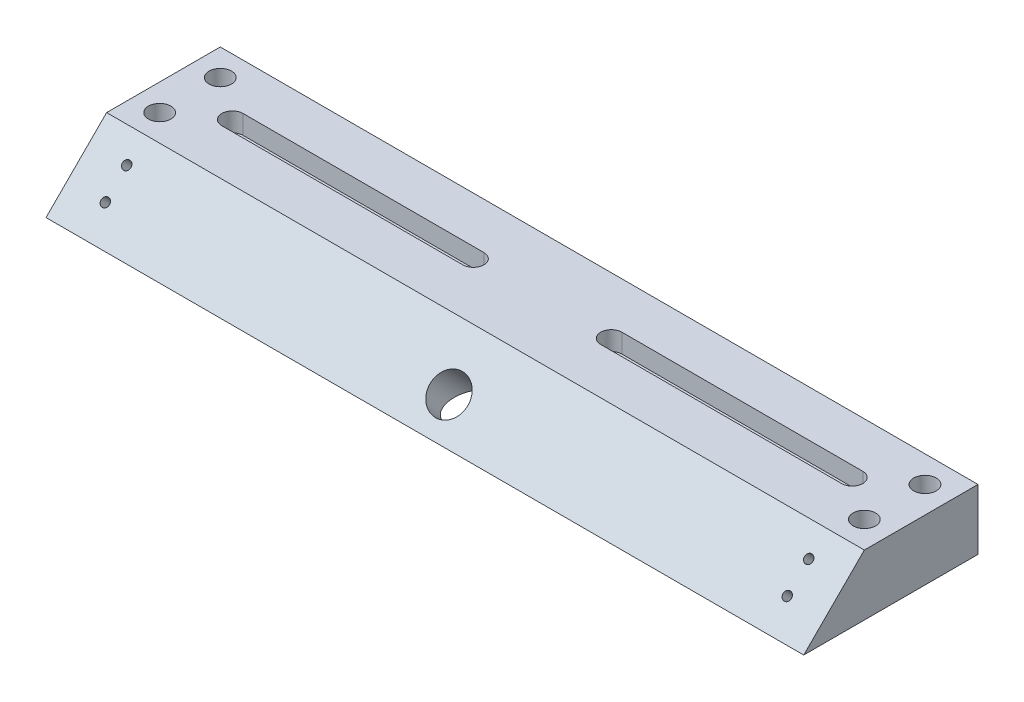
ISO-10303-21;
HEADER;
FILE_DESCRIPTION(('STEP AP214'),'2;1');
FILE_NAME('part.step','',(''),(''),'','','');
FILE_SCHEMA(('AUTOMOTIVE_DESIGN { 1 0 10303 214 1 1 1 1 }'));
ENDSEC;
DATA;
#1=APPLICATION_CONTEXT('core data for automotive mechanical design processes');
#2=APPLICATION_PROTOCOL_DEFINITION('international standard','automotive_design',2000,#1);
#3=PRODUCT_CONTEXT('',#1,'mechanical');
#4=PRODUCT('Part','Part','',(#3));
#5=PRODUCT_RELATED_PRODUCT_CATEGORY('part','',(#4));
#6=PRODUCT_DEFINITION_FORMATION('','',#4);
#7=PRODUCT_DEFINITION_CONTEXT('part definition',#1,'design');
#8=PRODUCT_DEFINITION('design','',#6,#7);
#9=PRODUCT_DEFINITION_SHAPE('','',#8);
#10=(LENGTH_UNIT() NAMED_UNIT(*) SI_UNIT(.MILLI.,.METRE.));
#11=(NAMED_UNIT(*) PLANE_ANGLE_UNIT() SI_UNIT($,.RADIAN.));
#12=(NAMED_UNIT(*) SI_UNIT($,.STERADIAN.) SOLID_ANGLE_UNIT());
#13=UNCERTAINTY_MEASURE_WITH_UNIT(LENGTH_MEASURE(1.E-05),#10,'distance_accuracy_value','');
#14=(GEOMETRIC_REPRESENTATION_CONTEXT(3) GLOBAL_UNCERTAINTY_ASSIGNED_CONTEXT((#13)) GLOBAL_UNIT_ASSIGNED_CONTEXT((#10,
#11,#12)) REPRESENTATION_CONTEXT('',''));
#15=CARTESIAN_POINT('',(0.,0.,0.));
#16=DIRECTION('',(0.,0.,1.));
#17=DIRECTION('',(1.,0.,0.));
#18=AXIS2_PLACEMENT_3D('',#15,#16,#17);
#19=CARTESIAN_POINT('',(0.,20.32,0.));
#20=DIRECTION('',(0.,-1.,0.));
#21=DIRECTION('',(0.,0.,-1.));
#22=AXIS2_PLACEMENT_3D('',#19,#20,#21);
#23=PLANE('',#22);
#24=DIRECTION('',(-1.,0.,0.));
#25=VECTOR('',#24,1.);
#26=CARTESIAN_POINT('',(0.,20.32,-9.1440000000002));
#27=LINE('',#26,#25);
#28=CARTESIAN_POINT('',(103.886,20.32,-9.14400000000019));
#29=VERTEX_POINT('',#28);
#30=CARTESIAN_POINT('',(23.114,20.32,-9.1440000000002));
#31=VERTEX_POINT('',#30);
#32=EDGE_CURVE('E158',#29,#31,#27,.T.);
#33=ORIENTED_EDGE('',*,*,#32,.T.);
#34=CARTESIAN_POINT('',(23.114,20.32,-12.7000000000002));
#35=DIRECTION('',(0.,-1.,0.));
#36=DIRECTION('',(0.,0.,1.));
#37=AXIS2_PLACEMENT_3D('',#34,#35,#36);
#38=CIRCLE('',#37,3.55599999999999);
#39=CARTESIAN_POINT('',(23.114,20.32,-16.2560000000002));
#40=VERTEX_POINT('',#39);
#41=EDGE_CURVE('E52',#40,#31,#38,.F.);
#42=ORIENTED_EDGE('',*,*,#41,.F.);
#43=DIRECTION('',(-1.,0.,0.));
#44=VECTOR('',#43,1.);
#45=CARTESIAN_POINT('',(0.,20.32,-16.2560000000002));
#46=LINE('',#45,#44);
#47=CARTESIAN_POINT('',(103.886,20.32,-16.2560000000002));
#48=VERTEX_POINT('',#47);
#49=EDGE_CURVE('E146',#48,#40,#46,.T.);
#50=ORIENTED_EDGE('',*,*,#49,.F.);
#51=CARTESIAN_POINT('',(103.886,20.32,-12.7000000000002));
#52=DIRECTION('',(0.,-1.,0.));
#53=DIRECTION('',(0.,0.,1.));
#54=AXIS2_PLACEMENT_3D('',#51,#52,#53);
#55=CIRCLE('',#54,3.556);
#56=EDGE_CURVE('E149',#48,#29,#55,.T.);
#57=ORIENTED_EDGE('',*,*,#56,.T.);
#58=EDGE_LOOP('',(#33,#42,#50,#57));
#59=FACE_BOUND('',#58,.T.);
#60=CARTESIAN_POINT('',(-118.11,20.32,-22.86));
#61=DIRECTION('',(0.,1.,0.));
#62=DIRECTION('',(0.,0.,-1.));
#63=AXIS2_PLACEMENT_3D('',#60,#61,#62);
#64=CIRCLE('',#63,3.7719);
#65=CARTESIAN_POINT('',(-118.11,20.32,-26.6319));
#66=VERTEX_POINT('',#65);
#67=EDGE_CURVE('E179',#66,#66,#64,.T.);
#68=ORIENTED_EDGE('',*,*,#67,.F.);
#69=EDGE_LOOP('',(#68));
#70=FACE_BOUND('',#69,.T.);
#71=CARTESIAN_POINT('',(118.11,20.32,-2.54000000000001));
#72=DIRECTION('',(0.,1.,0.));
#73=DIRECTION('',(0.,0.,-1.));
#74=AXIS2_PLACEMENT_3D('',#71,#72,#73);
#75=CIRCLE('',#74,3.7719);
#76=CARTESIAN_POINT('',(118.11,20.32,-6.31190000000001));
#77=VERTEX_POINT('',#76);
#78=EDGE_CURVE('E172',#77,#77,#75,.T.);
#79=ORIENTED_EDGE('',*,*,#78,.F.);
#80=EDGE_LOOP('',(#79));
#81=FACE_BOUND('',#80,.T.);
#82=CARTESIAN_POINT('',(118.11,20.32,-22.86));
#83=DIRECTION('',(0.,1.,0.));
#84=DIRECTION('',(0.,0.,1.));
#85=AXIS2_PLACEMENT_3D('',#82,#83,#84);
#86=CIRCLE('',#85,3.7719);
#87=CARTESIAN_POINT('',(118.11,20.32,-19.0881));
#88=VERTEX_POINT('',#87);
#89=EDGE_CURVE('E165',#88,#88,#86,.T.);
#90=ORIENTED_EDGE('',*,*,#89,.F.);
#91=EDGE_LOOP('',(#90));
#92=FACE_BOUND('',#91,.T.);
#93=CARTESIAN_POINT('',(-118.11,20.32,-2.54000000000001));
#94=DIRECTION('',(0.,1.,0.));
#95=DIRECTION('',(0.,0.,1.));
#96=AXIS2_PLACEMENT_3D('',#93,#94,#95);
#97=CIRCLE('',#96,3.7719);
#98=CARTESIAN_POINT('',(-118.11,20.32,1.23189999999998));
#99=VERTEX_POINT('',#98);
#100=EDGE_CURVE('E178',#99,#99,#97,.T.);
#101=ORIENTED_EDGE('',*,*,#100,.F.);
#102=EDGE_LOOP('',(#101));
#103=FACE_BOUND('',#102,.T.);
#104=DIRECTION('',(0.,0.,1.));
#105=VECTOR('',#104,1.);
#106=CARTESIAN_POINT('',(-127.,20.32,31.75));
#107=LINE('',#106,#105);
#108=CARTESIAN_POINT('',(-127.,20.32,-31.75));
#109=VERTEX_POINT('',#108);
#110=CARTESIAN_POINT('',(-127.,20.32,6.34999999999956));
#111=VERTEX_POINT('',#110);
#112=EDGE_CURVE('E226',#109,#111,#107,.T.);
#113=ORIENTED_EDGE('',*,*,#112,.T.);
#114=DIRECTION('',(1.,0.,0.));
#115=VECTOR('',#114,1.);
#116=CARTESIAN_POINT('',(0.,20.32,6.34999999999956));
#117=LINE('',#116,#115);
#118=CARTESIAN_POINT('',(127.,20.32,6.34999999999956));
#119=VERTEX_POINT('',#118);
#120=EDGE_CURVE('E240',#111,#119,#117,.T.);
#121=ORIENTED_EDGE('',*,*,#120,.T.);
#122=DIRECTION('',(0.,0.,-1.));
#123=VECTOR('',#122,1.);
#124=CARTESIAN_POINT('',(127.,20.32,31.75));
#125=LINE('',#124,#123);
#126=CARTESIAN_POINT('',(127.,20.32,-31.75));
#127=VERTEX_POINT('',#126);
#128=EDGE_CURVE('E221',#119,#127,#125,.T.);
#129=ORIENTED_EDGE('',*,*,#128,.T.);
#130=DIRECTION('',(-1.,0.,0.));
#131=VECTOR('',#130,1.);
#132=CARTESIAN_POINT('',(-127.,20.32,-31.75));
#133=LINE('',#132,#131);
#134=EDGE_CURVE('E223',#127,#109,#133,.T.);
#135=ORIENTED_EDGE('',*,*,#134,.T.);
#136=EDGE_LOOP('',(#113,#121,#129,#135));
#137=FACE_BOUND('',#136,.T.);
#138=CARTESIAN_POINT('',(-23.114,20.32,-12.7000000000002));
#139=DIRECTION('',(0.,1.,0.));
#140=DIRECTION('',(0.,0.,1.));
#141=AXIS2_PLACEMENT_3D('',#138,#139,#140);
#142=CIRCLE('',#141,3.55599999999999);
#143=CARTESIAN_POINT('',(-23.114,20.32,-16.2560000000002));
#144=VERTEX_POINT('',#143);
#145=CARTESIAN_POINT('',(-23.114,20.32,-9.1440000000002));
#146=VERTEX_POINT('',#145);
#147=EDGE_CURVE('E60',#144,#146,#142,.F.);
#148=ORIENTED_EDGE('',*,*,#147,.T.);
#149=DIRECTION('',(1.,0.,0.));
#150=VECTOR('',#149,1.);
#151=CARTESIAN_POINT('',(0.,20.32,-9.1440000000002));
#152=LINE('',#151,#150);
#153=CARTESIAN_POINT('',(-103.886,20.32,-9.14400000000019));
#154=VERTEX_POINT('',#153);
#155=EDGE_CURVE('E195',#154,#146,#152,.T.);
#156=ORIENTED_EDGE('',*,*,#155,.F.);
#157=CARTESIAN_POINT('',(-103.886,20.32,-12.7000000000002));
#158=DIRECTION('',(0.,1.,0.));
#159=DIRECTION('',(0.,0.,1.));
#160=AXIS2_PLACEMENT_3D('',#157,#158,#159);
#161=CIRCLE('',#160,3.556);
#162=CARTESIAN_POINT('',(-103.886,20.32,-16.2560000000002));
#163=VERTEX_POINT('',#162);
#164=EDGE_CURVE('E208',#163,#154,#161,.T.);
#165=ORIENTED_EDGE('',*,*,#164,.F.);
#166=DIRECTION('',(1.,0.,0.));
#167=VECTOR('',#166,1.);
#168=CARTESIAN_POINT('',(0.,20.32,-16.2560000000002));
#169=LINE('',#168,#167);
#170=EDGE_CURVE('E205',#163,#144,#169,.T.);
#171=ORIENTED_EDGE('',*,*,#170,.T.);
#172=EDGE_LOOP('',(#148,#156,#165,#171));
#173=FACE_BOUND('',#172,.T.);
#174=ADVANCED_FACE('F36',(#59,#70,#81,#92,#103,#137,#173),#23,.F.);
#175=CARTESIAN_POINT('',(127.,20.32,31.75));
#176=DIRECTION('',(-1.,0.,0.));
#177=DIRECTION('',(0.,0.,1.));
#178=AXIS2_PLACEMENT_3D('',#175,#176,#177);
#179=PLANE('',#178);
#180=ORIENTED_EDGE('',*,*,#128,.F.);
#181=DIRECTION('',(0.,0.707106781186544,-0.707106781186551));
#182=VECTOR('',#181,1.);
#183=CARTESIAN_POINT('',(127.,20.32,6.34999999999956));
#184=LINE('',#183,#182);
#185=CARTESIAN_POINT('',(127.,0.,26.6699999999998));
#186=VERTEX_POINT('',#185);
#187=EDGE_CURVE('E243',#119,#186,#184,.F.);
#188=ORIENTED_EDGE('',*,*,#187,.T.);
#189=DIRECTION('',(0.,0.,-1.));
#190=VECTOR('',#189,1.);
#191=CARTESIAN_POINT('',(127.,0.,31.75));
#192=LINE('',#191,#190);
#193=CARTESIAN_POINT('',(127.,0.,-31.75));
#194=VERTEX_POINT('',#193);
#195=EDGE_CURVE('E215',#186,#194,#192,.T.);
#196=ORIENTED_EDGE('',*,*,#195,.T.);
#197=DIRECTION('',(0.,-1.,0.));
#198=VECTOR('',#197,1.);
#199=CARTESIAN_POINT('',(127.,20.32,-31.75));
#200=LINE('',#199,#198);
#201=EDGE_CURVE('E237',#127,#194,#200,.T.);
#202=ORIENTED_EDGE('',*,*,#201,.F.);
#203=EDGE_LOOP('',(#180,#188,#196,#202));
#204=FACE_BOUND('',#203,.T.);
#205=ADVANCED_FACE('F263',(#204),#179,.F.);
#206=CARTESIAN_POINT('',(-127.,20.32,-31.75));
#207=DIRECTION('',(0.,0.,1.));
#208=DIRECTION('',(1.,0.,0.));
#209=AXIS2_PLACEMENT_3D('',#206,#207,#208);
#210=PLANE('',#209);
#211=DIRECTION('',(-1.,0.,0.));
#212=VECTOR('',#211,1.);
#213=CARTESIAN_POINT('',(-127.,0.,-31.75));
#214=LINE('',#213,#212);
#215=CARTESIAN_POINT('',(-127.,0.,-31.75));
#216=VERTEX_POINT('',#215);
#217=EDGE_CURVE('E231',#194,#216,#214,.T.);
#218=ORIENTED_EDGE('',*,*,#217,.T.);
#219=DIRECTION('',(0.,-1.,0.));
#220=VECTOR('',#219,1.);
#221=CARTESIAN_POINT('',(-127.,20.32,-31.75));
#222=LINE('',#221,#220);
#223=EDGE_CURVE('E229',#109,#216,#222,.T.);
#224=ORIENTED_EDGE('',*,*,#223,.F.);
#225=ORIENTED_EDGE('',*,*,#134,.F.);
#226=ORIENTED_EDGE('',*,*,#201,.T.);
#227=EDGE_LOOP('',(#218,#224,#225,#226));
#228=FACE_BOUND('',#227,.T.);
#229=ADVANCED_FACE('F265',(#228),#210,.F.);
#230=CARTESIAN_POINT('',(-127.,20.32,31.75));
#231=DIRECTION('',(1.,0.,0.));
#232=DIRECTION('',(0.,0.,-1.));
#233=AXIS2_PLACEMENT_3D('',#230,#231,#232);
#234=PLANE('',#233);
#235=DIRECTION('',(0.,0.,1.));
#236=VECTOR('',#235,1.);
#237=CARTESIAN_POINT('',(-127.,0.,31.75));
#238=LINE('',#237,#236);
#239=CARTESIAN_POINT('',(-127.,0.,26.6699999999998));
#240=VERTEX_POINT('',#239);
#241=EDGE_CURVE('E224',#216,#240,#238,.T.);
#242=ORIENTED_EDGE('',*,*,#241,.T.);
#243=DIRECTION('',(0.,-0.707106781186544,0.707106781186551));
#244=VECTOR('',#243,1.);
#245=CARTESIAN_POINT('',(-127.,20.32,6.34999999999956));
#246=LINE('',#245,#244);
#247=EDGE_CURVE('E11',#240,#111,#246,.F.);
#248=ORIENTED_EDGE('',*,*,#247,.T.);
#249=ORIENTED_EDGE('',*,*,#112,.F.);
#250=ORIENTED_EDGE('',*,*,#223,.T.);
#251=EDGE_LOOP('',(#242,#248,#249,#250));
#252=FACE_BOUND('',#251,.T.);
#253=ADVANCED_FACE('F253',(#252),#234,.F.);
#254=CARTESIAN_POINT('',(0.,0.,0.));
#255=DIRECTION('',(0.,-1.,0.));
#256=DIRECTION('',(0.,0.,-1.));
#257=AXIS2_PLACEMENT_3D('',#254,#255,#256);
#258=PLANE('',#257);
#259=CARTESIAN_POINT('',(0.,0.,10.5055389820753));
#260=DIRECTION('',(0.,-1.,0.));
#261=DIRECTION('',(0.,0.,1.));
#262=AXIS2_PLACEMENT_3D('',#259,#260,#261);
#263=ELLIPSE('',#262,8.98025612106911,6.35);
#264=CARTESIAN_POINT('',(0.,0.,19.4857951031444));
#265=VERTEX_POINT('',#264);
#266=EDGE_CURVE('E292',#265,#265,#263,.T.);
#267=ORIENTED_EDGE('',*,*,#266,.F.);
#268=EDGE_LOOP('',(#267));
#269=FACE_BOUND('',#268,.T.);
#270=CARTESIAN_POINT('',(-118.11,0.,-22.86));
#271=DIRECTION('',(0.,1.,0.));
#272=DIRECTION('',(0.,0.,-1.));
#273=AXIS2_PLACEMENT_3D('',#270,#271,#272);
#274=CIRCLE('',#273,3.7719);
#275=CARTESIAN_POINT('',(-118.11,0.,-26.6319));
#276=VERTEX_POINT('',#275);
#277=EDGE_CURVE('E175',#276,#276,#274,.T.);
#278=ORIENTED_EDGE('',*,*,#277,.T.);
#279=EDGE_LOOP('',(#278));
#280=FACE_BOUND('',#279,.T.);
#281=CARTESIAN_POINT('',(118.11,0.,-2.54000000000001));
#282=DIRECTION('',(0.,1.,0.));
#283=DIRECTION('',(0.,0.,-1.));
#284=AXIS2_PLACEMENT_3D('',#281,#282,#283);
#285=CIRCLE('',#284,3.7719);
#286=CARTESIAN_POINT('',(118.11,0.,-6.31190000000001));
#287=VERTEX_POINT('',#286);
#288=EDGE_CURVE('E182',#287,#287,#285,.T.);
#289=ORIENTED_EDGE('',*,*,#288,.T.);
#290=EDGE_LOOP('',(#289));
#291=FACE_BOUND('',#290,.T.);
#292=CARTESIAN_POINT('',(118.11,0.,-22.86));
#293=DIRECTION('',(0.,1.,0.));
#294=DIRECTION('',(0.,0.,1.));
#295=AXIS2_PLACEMENT_3D('',#292,#293,#294);
#296=CIRCLE('',#295,3.7719);
#297=CARTESIAN_POINT('',(118.11,0.,-19.0881));
#298=VERTEX_POINT('',#297);
#299=EDGE_CURVE('E169',#298,#298,#296,.T.);
#300=ORIENTED_EDGE('',*,*,#299,.T.);
#301=EDGE_LOOP('',(#300));
#302=FACE_BOUND('',#301,.T.);
#303=CARTESIAN_POINT('',(-118.11,0.,-2.54000000000001));
#304=DIRECTION('',(0.,1.,0.));
#305=DIRECTION('',(0.,0.,1.));
#306=AXIS2_PLACEMENT_3D('',#303,#304,#305);
#307=CIRCLE('',#306,3.7719);
#308=CARTESIAN_POINT('',(-118.11,0.,1.23189999999998));
#309=VERTEX_POINT('',#308);
#310=EDGE_CURVE('E187',#309,#309,#307,.T.);
#311=ORIENTED_EDGE('',*,*,#310,.T.);
#312=EDGE_LOOP('',(#311));
#313=FACE_BOUND('',#312,.T.);
#314=ORIENTED_EDGE('',*,*,#195,.F.);
#315=DIRECTION('',(1.,0.,0.));
#316=VECTOR('',#315,1.);
#317=CARTESIAN_POINT('',(0.,0.,26.6699999999998));
#318=LINE('',#317,#316);
#319=EDGE_CURVE('E45',#186,#240,#318,.F.);
#320=ORIENTED_EDGE('',*,*,#319,.T.);
#321=ORIENTED_EDGE('',*,*,#241,.F.);
#322=ORIENTED_EDGE('',*,*,#217,.F.);
#323=EDGE_LOOP('',(#314,#320,#321,#322));
#324=FACE_BOUND('',#323,.T.);
#325=ADVANCED_FACE('F248',(#269,#280,#291,#302,#313,#324),#258,.T.);
#326=CARTESIAN_POINT('',(0.,20.32,6.34999999999956));
#327=DIRECTION('',(0.,-0.707106781186551,-0.707106781186544));
#328=DIRECTION('',(1.,0.,0.));
#329=AXIS2_PLACEMENT_3D('',#326,#327,#328);
#330=PLANE('',#329);
#331=CARTESIAN_POINT('',(0.,8.08223050896222,18.5877694910375));
#332=DIRECTION('',(0.,0.707106781186551,0.707106781186544));
#333=DIRECTION('',(0.,-0.707106781186544,0.707106781186551));
#334=AXIS2_PLACEMENT_3D('',#331,#332,#333);
#335=CIRCLE('',#334,6.35);
#336=CARTESIAN_POINT('',(0.,3.59210244842766,23.0778975515721));
#337=VERTEX_POINT('',#336);
#338=EDGE_CURVE('E546',#337,#337,#335,.T.);
#339=ORIENTED_EDGE('',*,*,#338,.F.);
#340=EDGE_LOOP('',(#339));
#341=FACE_BOUND('',#340,.T.);
#342=CARTESIAN_POINT('',(114.3,14.3684097937106,12.3015902062891));
#343=DIRECTION('',(0.,0.707106781186546,0.707106781186549));
#344=DIRECTION('',(0.,0.707106781186549,-0.707106781186546));
#345=AXIS2_PLACEMENT_3D('',#342,#343,#344);
#346=CIRCLE('',#345,1.42240000000001);
#347=CARTESIAN_POINT('',(114.3,15.3741984792703,11.2958015207293));
#348=VERTEX_POINT('',#347);
#349=EDGE_CURVE('E560',#348,#348,#346,.T.);
#350=ORIENTED_EDGE('',*,*,#349,.F.);
#351=EDGE_LOOP('',(#350));
#352=FACE_BOUND('',#351,.T.);
#353=CARTESIAN_POINT('',(-114.3,7.18420489685524,19.4857951031444));
#354=DIRECTION('',(0.,0.707106781186546,0.707106781186549));
#355=DIRECTION('',(0.,0.707106781186549,-0.707106781186546));
#356=AXIS2_PLACEMENT_3D('',#353,#354,#355);
#357=CIRCLE('',#356,1.42240000000001);
#358=CARTESIAN_POINT('',(-114.3,8.189993582415,18.4800064175846));
#359=VERTEX_POINT('',#358);
#360=EDGE_CURVE('E554',#359,#359,#357,.T.);
#361=ORIENTED_EDGE('',*,*,#360,.F.);
#362=EDGE_LOOP('',(#361));
#363=FACE_BOUND('',#362,.T.);
#364=CARTESIAN_POINT('',(-114.3,14.3684097937106,12.3015902062891));
#365=DIRECTION('',(0.,0.707106781186546,0.707106781186549));
#366=DIRECTION('',(0.,-0.707106781186549,0.707106781186546));
#367=AXIS2_PLACEMENT_3D('',#364,#365,#366);
#368=CIRCLE('',#367,1.42240000000001);
#369=CARTESIAN_POINT('',(-114.3,13.3626211081508,13.3073788918488));
#370=VERTEX_POINT('',#369);
#371=EDGE_CURVE('E548',#370,#370,#368,.T.);
#372=ORIENTED_EDGE('',*,*,#371,.F.);
#373=EDGE_LOOP('',(#372));
#374=FACE_BOUND('',#373,.T.);
#375=CARTESIAN_POINT('',(114.3,7.18420489685524,19.4857951031444));
#376=DIRECTION('',(0.,0.707106781186546,0.707106781186549));
#377=DIRECTION('',(0.,-0.707106781186549,0.707106781186546));
#378=AXIS2_PLACEMENT_3D('',#375,#376,#377);
#379=CIRCLE('',#378,1.42240000000001);
#380=CARTESIAN_POINT('',(114.3,6.17841621129549,20.4915837887041));
#381=VERTEX_POINT('',#380);
#382=EDGE_CURVE('E152',#381,#381,#379,.T.);
#383=ORIENTED_EDGE('',*,*,#382,.F.);
#384=EDGE_LOOP('',(#383));
#385=FACE_BOUND('',#384,.T.);
#386=ORIENTED_EDGE('',*,*,#247,.F.);
#387=ORIENTED_EDGE('',*,*,#319,.F.);
#388=ORIENTED_EDGE('',*,*,#187,.F.);
#389=ORIENTED_EDGE('',*,*,#120,.F.);
#390=EDGE_LOOP('',(#386,#387,#388,#389));
#391=FACE_BOUND('',#390,.T.);
#392=ADVANCED_FACE('F39',(#341,#352,#363,#374,#385,#391),#330,.F.);
#393=CARTESIAN_POINT('',(-23.114,13.97,-12.7000000000002));
#394=DIRECTION('',(0.,1.,0.));
#395=DIRECTION('',(0.,0.,1.));
#396=AXIS2_PLACEMENT_3D('',#393,#394,#395);
#397=CYLINDRICAL_SURFACE('',#396,3.55599999999999);
#398=ORIENTED_EDGE('',*,*,#147,.F.);
#399=DIRECTION('',(0.,1.,0.));
#400=VECTOR('',#399,1.);
#401=CARTESIAN_POINT('',(-23.114,13.97,-16.2560000000002));
#402=LINE('',#401,#400);
#403=CARTESIAN_POINT('',(-23.114,13.97,-16.2560000000002));
#404=VERTEX_POINT('',#403);
#405=EDGE_CURVE('E203',#404,#144,#402,.T.);
#406=ORIENTED_EDGE('',*,*,#405,.F.);
#407=CARTESIAN_POINT('',(-23.114,13.97,-12.7000000000002));
#408=DIRECTION('',(0.,1.,0.));
#409=DIRECTION('',(0.,0.,1.));
#410=AXIS2_PLACEMENT_3D('',#407,#408,#409);
#411=CIRCLE('',#410,3.55599999999999);
#412=CARTESIAN_POINT('',(-23.114,13.97,-9.1440000000002));
#413=VERTEX_POINT('',#412);
#414=EDGE_CURVE('E192',#404,#413,#411,.F.);
#415=ORIENTED_EDGE('',*,*,#414,.T.);
#416=DIRECTION('',(0.,1.,0.));
#417=VECTOR('',#416,1.);
#418=CARTESIAN_POINT('',(-23.114,13.97,-9.1440000000002));
#419=LINE('',#418,#417);
#420=EDGE_CURVE('E213',#413,#146,#419,.T.);
#421=ORIENTED_EDGE('',*,*,#420,.T.);
#422=EDGE_LOOP('',(#398,#406,#415,#421));
#423=FACE_BOUND('',#422,.T.);
#424=ADVANCED_FACE('F281',(#423),#397,.F.);
#425=CARTESIAN_POINT('',(0.,13.97,-9.1440000000002));
#426=DIRECTION('',(0.,0.,1.));
#427=DIRECTION('',(1.,0.,0.));
#428=AXIS2_PLACEMENT_3D('',#425,#426,#427);
#429=PLANE('',#428);
#430=ORIENTED_EDGE('',*,*,#155,.T.);
#431=ORIENTED_EDGE('',*,*,#420,.F.);
#432=DIRECTION('',(1.,0.,0.));
#433=VECTOR('',#432,1.);
#434=CARTESIAN_POINT('',(0.,13.97,-9.1440000000002));
#435=LINE('',#434,#433);
#436=CARTESIAN_POINT('',(-103.886,13.97,-9.14400000000019));
#437=VERTEX_POINT('',#436);
#438=EDGE_CURVE('E200',#437,#413,#435,.T.);
#439=ORIENTED_EDGE('',*,*,#438,.F.);
#440=DIRECTION('',(0.,1.,0.));
#441=VECTOR('',#440,1.);
#442=CARTESIAN_POINT('',(-103.886,13.97,-9.14400000000019));
#443=LINE('',#442,#441);
#444=EDGE_CURVE('E216',#437,#154,#443,.T.);
#445=ORIENTED_EDGE('',*,*,#444,.T.);
#446=EDGE_LOOP('',(#430,#431,#439,#445));
#447=FACE_BOUND('',#446,.T.);
#448=ADVANCED_FACE('F322',(#447),#429,.F.);
#449=CARTESIAN_POINT('',(-103.886,13.97,-12.7000000000002));
#450=DIRECTION('',(0.,1.,0.));
#451=DIRECTION('',(0.,0.,1.));
#452=AXIS2_PLACEMENT_3D('',#449,#450,#451);
#453=CYLINDRICAL_SURFACE('',#452,3.556);
#454=ORIENTED_EDGE('',*,*,#164,.T.);
#455=ORIENTED_EDGE('',*,*,#444,.F.);
#456=CARTESIAN_POINT('',(-103.886,13.97,-12.7000000000002));
#457=DIRECTION('',(0.,1.,0.));
#458=DIRECTION('',(0.,0.,1.));
#459=AXIS2_PLACEMENT_3D('',#456,#457,#458);
#460=CIRCLE('',#459,3.556);
#461=CARTESIAN_POINT('',(-103.886,13.97,-16.2560000000002));
#462=VERTEX_POINT('',#461);
#463=EDGE_CURVE('E197',#462,#437,#460,.T.);
#464=ORIENTED_EDGE('',*,*,#463,.F.);
#465=DIRECTION('',(0.,1.,0.));
#466=VECTOR('',#465,1.);
#467=CARTESIAN_POINT('',(-103.886,13.97,-16.2560000000002));
#468=LINE('',#467,#466);
#469=EDGE_CURVE('E218',#462,#163,#468,.T.);
#470=ORIENTED_EDGE('',*,*,#469,.T.);
#471=EDGE_LOOP('',(#454,#455,#464,#470));
#472=FACE_BOUND('',#471,.T.);
#473=ADVANCED_FACE('F325',(#472),#453,.F.);
#474=CARTESIAN_POINT('',(0.,13.97,-16.2560000000002));
#475=DIRECTION('',(0.,0.,1.));
#476=DIRECTION('',(1.,0.,0.));
#477=AXIS2_PLACEMENT_3D('',#474,#475,#476);
#478=PLANE('',#477);
#479=ORIENTED_EDGE('',*,*,#170,.F.);
#480=ORIENTED_EDGE('',*,*,#469,.F.);
#481=DIRECTION('',(1.,0.,0.));
#482=VECTOR('',#481,1.);
#483=CARTESIAN_POINT('',(0.,13.97,-16.2560000000002));
#484=LINE('',#483,#482);
#485=EDGE_CURVE('E194',#462,#404,#484,.T.);
#486=ORIENTED_EDGE('',*,*,#485,.T.);
#487=ORIENTED_EDGE('',*,*,#405,.T.);
#488=EDGE_LOOP('',(#479,#480,#486,#487));
#489=FACE_BOUND('',#488,.T.);
#490=ADVANCED_FACE('F316',(#489),#478,.T.);
#491=CARTESIAN_POINT('',(0.,13.97,0.));
#492=DIRECTION('',(0.,1.,0.));
#493=DIRECTION('',(0.,0.,1.));
#494=AXIS2_PLACEMENT_3D('',#491,#492,#493);
#495=PLANE('',#494);
#496=ORIENTED_EDGE('',*,*,#414,.F.);
#497=ORIENTED_EDGE('',*,*,#485,.F.);
#498=ORIENTED_EDGE('',*,*,#463,.T.);
#499=ORIENTED_EDGE('',*,*,#438,.T.);
#500=EDGE_LOOP('',(#496,#497,#498,#499));
#501=FACE_BOUND('',#500,.T.);
#502=ADVANCED_FACE('F305',(#501),#495,.T.);
#503=CARTESIAN_POINT('',(-118.11,0.,-2.54000000000001));
#504=DIRECTION('',(0.,1.,0.));
#505=DIRECTION('',(0.,0.,1.));
#506=AXIS2_PLACEMENT_3D('',#503,#504,#505);
#507=CYLINDRICAL_SURFACE('',#506,3.7719);
#508=ORIENTED_EDGE('',*,*,#310,.F.);
#509=EDGE_LOOP('',(#508));
#510=FACE_BOUND('',#509,.T.);
#511=ORIENTED_EDGE('',*,*,#100,.T.);
#512=EDGE_LOOP('',(#511));
#513=FACE_BOUND('',#512,.T.);
#514=ADVANCED_FACE('F301',(#510,#513),#507,.F.);
#515=CARTESIAN_POINT('',(118.11,0.,-22.86));
#516=DIRECTION('',(0.,1.,0.));
#517=DIRECTION('',(0.,0.,1.));
#518=AXIS2_PLACEMENT_3D('',#515,#516,#517);
#519=CYLINDRICAL_SURFACE('',#518,3.7719);
#520=ORIENTED_EDGE('',*,*,#299,.F.);
#521=EDGE_LOOP('',(#520));
#522=FACE_BOUND('',#521,.T.);
#523=ORIENTED_EDGE('',*,*,#89,.T.);
#524=EDGE_LOOP('',(#523));
#525=FACE_BOUND('',#524,.T.);
#526=ADVANCED_FACE('F304',(#522,#525),#519,.F.);
#527=CARTESIAN_POINT('',(118.11,0.,-2.54000000000001));
#528=DIRECTION('',(0.,1.,0.));
#529=DIRECTION('',(0.,0.,1.));
#530=AXIS2_PLACEMENT_3D('',#527,#528,#529);
#531=CYLINDRICAL_SURFACE('',#530,3.7719);
#532=ORIENTED_EDGE('',*,*,#288,.F.);
#533=EDGE_LOOP('',(#532));
#534=FACE_BOUND('',#533,.T.);
#535=ORIENTED_EDGE('',*,*,#78,.T.);
#536=EDGE_LOOP('',(#535));
#537=FACE_BOUND('',#536,.T.);
#538=ADVANCED_FACE('F313',(#534,#537),#531,.F.);
#539=CARTESIAN_POINT('',(-118.11,0.,-22.86));
#540=DIRECTION('',(0.,1.,0.));
#541=DIRECTION('',(0.,0.,1.));
#542=AXIS2_PLACEMENT_3D('',#539,#540,#541);
#543=CYLINDRICAL_SURFACE('',#542,3.7719);
#544=ORIENTED_EDGE('',*,*,#277,.F.);
#545=EDGE_LOOP('',(#544));
#546=FACE_BOUND('',#545,.T.);
#547=ORIENTED_EDGE('',*,*,#67,.T.);
#548=EDGE_LOOP('',(#547));
#549=FACE_BOUND('',#548,.T.);
#550=ADVANCED_FACE('F384',(#546,#549),#543,.F.);
#551=CARTESIAN_POINT('',(23.114,13.97,-12.7000000000002));
#552=DIRECTION('',(0.,1.,0.));
#553=DIRECTION('',(0.,0.,1.));
#554=AXIS2_PLACEMENT_3D('',#551,#552,#553);
#555=CYLINDRICAL_SURFACE('',#554,3.55599999999999);
#556=ORIENTED_EDGE('',*,*,#41,.T.);
#557=DIRECTION('',(0.,1.,0.));
#558=VECTOR('',#557,1.);
#559=CARTESIAN_POINT('',(23.114,13.97,-9.1440000000002));
#560=LINE('',#559,#558);
#561=CARTESIAN_POINT('',(23.114,13.97,-9.1440000000002));
#562=VERTEX_POINT('',#561);
#563=EDGE_CURVE('E130',#562,#31,#560,.T.);
#564=ORIENTED_EDGE('',*,*,#563,.F.);
#565=CARTESIAN_POINT('',(23.114,13.97,-12.7000000000002));
#566=DIRECTION('',(0.,-1.,0.));
#567=DIRECTION('',(0.,0.,1.));
#568=AXIS2_PLACEMENT_3D('',#565,#566,#567);
#569=CIRCLE('',#568,3.55599999999999);
#570=CARTESIAN_POINT('',(23.114,13.97,-16.2560000000002));
#571=VERTEX_POINT('',#570);
#572=EDGE_CURVE('E137',#571,#562,#569,.F.);
#573=ORIENTED_EDGE('',*,*,#572,.F.);
#574=DIRECTION('',(0.,1.,0.));
#575=VECTOR('',#574,1.);
#576=CARTESIAN_POINT('',(23.114,13.97,-16.2560000000002));
#577=LINE('',#576,#575);
#578=EDGE_CURVE('E163',#571,#40,#577,.T.);
#579=ORIENTED_EDGE('',*,*,#578,.T.);
#580=EDGE_LOOP('',(#556,#564,#573,#579));
#581=FACE_BOUND('',#580,.T.);
#582=ADVANCED_FACE('F140',(#581),#555,.F.);
#583=CARTESIAN_POINT('',(0.,13.97,-16.2560000000002));
#584=DIRECTION('',(0.,0.,-1.));
#585=DIRECTION('',(-1.,0.,0.));
#586=AXIS2_PLACEMENT_3D('',#583,#584,#585);
#587=PLANE('',#586);
#588=ORIENTED_EDGE('',*,*,#49,.T.);
#589=ORIENTED_EDGE('',*,*,#578,.F.);
#590=DIRECTION('',(-1.,0.,0.));
#591=VECTOR('',#590,1.);
#592=CARTESIAN_POINT('',(0.,13.97,-16.2560000000002));
#593=LINE('',#592,#591);
#594=CARTESIAN_POINT('',(103.886,13.97,-16.2560000000002));
#595=VERTEX_POINT('',#594);
#596=EDGE_CURVE('E142',#595,#571,#593,.T.);
#597=ORIENTED_EDGE('',*,*,#596,.F.);
#598=DIRECTION('',(0.,1.,0.));
#599=VECTOR('',#598,1.);
#600=CARTESIAN_POINT('',(103.886,13.97,-16.2560000000002));
#601=LINE('',#600,#599);
#602=EDGE_CURVE('E166',#595,#48,#601,.T.);
#603=ORIENTED_EDGE('',*,*,#602,.T.);
#604=EDGE_LOOP('',(#588,#589,#597,#603));
#605=FACE_BOUND('',#604,.T.);
#606=ADVANCED_FACE('F406',(#605),#587,.F.);
#607=CARTESIAN_POINT('',(103.886,13.97,-12.7000000000002));
#608=DIRECTION('',(0.,1.,0.));
#609=DIRECTION('',(0.,0.,1.));
#610=AXIS2_PLACEMENT_3D('',#607,#608,#609);
#611=CYLINDRICAL_SURFACE('',#610,3.556);
#612=ORIENTED_EDGE('',*,*,#56,.F.);
#613=ORIENTED_EDGE('',*,*,#602,.F.);
#614=CARTESIAN_POINT('',(103.886,13.97,-12.7000000000002));
#615=DIRECTION('',(0.,-1.,0.));
#616=DIRECTION('',(0.,0.,1.));
#617=AXIS2_PLACEMENT_3D('',#614,#615,#616);
#618=CIRCLE('',#617,3.556);
#619=CARTESIAN_POINT('',(103.886,13.97,-9.14400000000019));
#620=VERTEX_POINT('',#619);
#621=EDGE_CURVE('E136',#595,#620,#618,.T.);
#622=ORIENTED_EDGE('',*,*,#621,.T.);
#623=DIRECTION('',(0.,1.,0.));
#624=VECTOR('',#623,1.);
#625=CARTESIAN_POINT('',(103.886,13.97,-9.14400000000019));
#626=LINE('',#625,#624);
#627=EDGE_CURVE('E132',#620,#29,#626,.T.);
#628=ORIENTED_EDGE('',*,*,#627,.T.);
#629=EDGE_LOOP('',(#612,#613,#622,#628));
#630=FACE_BOUND('',#629,.T.);
#631=ADVANCED_FACE('F415',(#630),#611,.F.);
#632=CARTESIAN_POINT('',(0.,13.97,-9.1440000000002));
#633=DIRECTION('',(0.,0.,-1.));
#634=DIRECTION('',(-1.,0.,0.));
#635=AXIS2_PLACEMENT_3D('',#632,#633,#634);
#636=PLANE('',#635);
#637=ORIENTED_EDGE('',*,*,#32,.F.);
#638=ORIENTED_EDGE('',*,*,#627,.F.);
#639=DIRECTION('',(-1.,0.,0.));
#640=VECTOR('',#639,1.);
#641=CARTESIAN_POINT('',(0.,13.97,-9.1440000000002));
#642=LINE('',#641,#640);
#643=EDGE_CURVE('E127',#620,#562,#642,.T.);
#644=ORIENTED_EDGE('',*,*,#643,.T.);
#645=ORIENTED_EDGE('',*,*,#563,.T.);
#646=EDGE_LOOP('',(#637,#638,#644,#645));
#647=FACE_BOUND('',#646,.T.);
#648=ADVANCED_FACE('F129',(#647),#636,.T.);
#649=CARTESIAN_POINT('',(0.,13.97,0.));
#650=DIRECTION('',(0.,1.,0.));
#651=DIRECTION('',(0.,0.,1.));
#652=AXIS2_PLACEMENT_3D('',#649,#650,#651);
#653=PLANE('',#652);
#654=ORIENTED_EDGE('',*,*,#572,.T.);
#655=ORIENTED_EDGE('',*,*,#643,.F.);
#656=ORIENTED_EDGE('',*,*,#621,.F.);
#657=ORIENTED_EDGE('',*,*,#596,.T.);
#658=EDGE_LOOP('',(#654,#655,#656,#657));
#659=FACE_BOUND('',#658,.T.);
#660=ADVANCED_FACE('F144',(#659),#653,.T.);
#661=CARTESIAN_POINT('',(114.3,1.97565634663514,14.2772465529243));
#662=DIRECTION('',(0.,0.707106781186546,0.707106781186549));
#663=DIRECTION('',(0.,-0.707106781186549,0.707106781186546));
#664=AXIS2_PLACEMENT_3D('',#661,#662,#663);
#665=CYLINDRICAL_SURFACE('',#664,1.42240000000001);
#666=CARTESIAN_POINT('',(114.3,1.97565634663514,14.2772465529243));
#667=DIRECTION('',(0.,0.707106781186546,0.707106781186549));
#668=DIRECTION('',(0.,-0.707106781186549,0.707106781186546));
#669=AXIS2_PLACEMENT_3D('',#666,#667,#668);
#670=CIRCLE('',#669,1.42240000000001);
#671=CARTESIAN_POINT('',(114.3,0.96986766107539,15.283035238484));
#672=VERTEX_POINT('',#671);
#673=EDGE_CURVE('E159',#672,#672,#670,.T.);
#674=ORIENTED_EDGE('',*,*,#673,.F.);
#675=EDGE_LOOP('',(#674));
#676=FACE_BOUND('',#675,.T.);
#677=ORIENTED_EDGE('',*,*,#382,.T.);
#678=EDGE_LOOP('',(#677));
#679=FACE_BOUND('',#678,.T.);
#680=ADVANCED_FACE('F442',(#676,#679),#665,.F.);
#681=CARTESIAN_POINT('',(114.3,1.97565634663514,14.2772465529243));
#682=DIRECTION('',(0.,0.707106781186546,0.707106781186549));
#683=DIRECTION('',(0.,-0.707106781186549,0.707106781186546));
#684=AXIS2_PLACEMENT_3D('',#681,#682,#683);
#685=PLANE('',#684);
#686=ORIENTED_EDGE('',*,*,#673,.T.);
#687=EDGE_LOOP('',(#686));
#688=FACE_BOUND('',#687,.T.);
#689=ADVANCED_FACE('F451',(#688),#685,.T.);
#690=CARTESIAN_POINT('',(-114.3,9.15986124349048,7.09304165606894));
#691=DIRECTION('',(0.,0.707106781186546,0.707106781186549));
#692=DIRECTION('',(0.,-0.707106781186549,0.707106781186546));
#693=AXIS2_PLACEMENT_3D('',#690,#691,#692);
#694=CYLINDRICAL_SURFACE('',#693,1.42240000000001);
#695=CARTESIAN_POINT('',(-114.3,9.15986124349048,7.09304165606894));
#696=DIRECTION('',(0.,0.707106781186546,0.707106781186549));
#697=DIRECTION('',(0.,-0.707106781186549,0.707106781186546));
#698=AXIS2_PLACEMENT_3D('',#695,#696,#697);
#699=CIRCLE('',#698,1.42240000000001);
#700=CARTESIAN_POINT('',(-114.3,8.15407255793073,8.09883034162869));
#701=VERTEX_POINT('',#700);
#702=EDGE_CURVE('E551',#701,#701,#699,.T.);
#703=ORIENTED_EDGE('',*,*,#702,.F.);
#704=EDGE_LOOP('',(#703));
#705=FACE_BOUND('',#704,.T.);
#706=ORIENTED_EDGE('',*,*,#371,.T.);
#707=EDGE_LOOP('',(#706));
#708=FACE_BOUND('',#707,.T.);
#709=ADVANCED_FACE('F461',(#705,#708),#694,.F.);
#710=CARTESIAN_POINT('',(-114.3,9.15986124349048,7.09304165606894));
#711=DIRECTION('',(0.,0.707106781186546,0.707106781186549));
#712=DIRECTION('',(0.,-0.707106781186549,0.707106781186546));
#713=AXIS2_PLACEMENT_3D('',#710,#711,#712);
#714=PLANE('',#713);
#715=ORIENTED_EDGE('',*,*,#702,.T.);
#716=EDGE_LOOP('',(#715));
#717=FACE_BOUND('',#716,.T.);
#718=ADVANCED_FACE('F471',(#717),#714,.T.);
#719=CARTESIAN_POINT('',(-114.3,1.97565634663514,14.2772465529243));
#720=DIRECTION('',(0.,0.707106781186546,0.707106781186549));
#721=DIRECTION('',(0.,-0.707106781186549,0.707106781186546));
#722=AXIS2_PLACEMENT_3D('',#719,#720,#721);
#723=CYLINDRICAL_SURFACE('',#722,1.42240000000001);
#724=CARTESIAN_POINT('',(-114.3,1.97565634663514,14.2772465529243));
#725=DIRECTION('',(0.,0.707106781186546,0.707106781186549));
#726=DIRECTION('',(0.,0.707106781186549,-0.707106781186546));
#727=AXIS2_PLACEMENT_3D('',#724,#725,#726);
#728=CIRCLE('',#727,1.42240000000001);
#729=CARTESIAN_POINT('',(-114.3,2.9814450321949,13.2714578673645));
#730=VERTEX_POINT('',#729);
#731=EDGE_CURVE('E563',#730,#730,#728,.T.);
#732=ORIENTED_EDGE('',*,*,#731,.F.);
#733=EDGE_LOOP('',(#732));
#734=FACE_BOUND('',#733,.T.);
#735=ORIENTED_EDGE('',*,*,#360,.T.);
#736=EDGE_LOOP('',(#735));
#737=FACE_BOUND('',#736,.T.);
#738=ADVANCED_FACE('F481',(#734,#737),#723,.F.);
#739=CARTESIAN_POINT('',(-114.3,1.97565634663514,14.2772465529243));
#740=DIRECTION('',(0.,-0.707106781186546,-0.707106781186549));
#741=DIRECTION('',(0.,0.707106781186549,-0.707106781186546));
#742=AXIS2_PLACEMENT_3D('',#739,#740,#741);
#743=PLANE('',#742);
#744=ORIENTED_EDGE('',*,*,#731,.T.);
#745=EDGE_LOOP('',(#744));
#746=FACE_BOUND('',#745,.T.);
#747=ADVANCED_FACE('F491',(#746),#743,.F.);
#748=CARTESIAN_POINT('',(114.3,9.15986124349048,7.09304165606894));
#749=DIRECTION('',(0.,0.707106781186546,0.707106781186549));
#750=DIRECTION('',(0.,-0.707106781186549,0.707106781186546));
#751=AXIS2_PLACEMENT_3D('',#748,#749,#750);
#752=CYLINDRICAL_SURFACE('',#751,1.42240000000001);
#753=CARTESIAN_POINT('',(114.3,9.15986124349048,7.09304165606894));
#754=DIRECTION('',(0.,0.707106781186546,0.707106781186549));
#755=DIRECTION('',(0.,0.707106781186549,-0.707106781186546));
#756=AXIS2_PLACEMENT_3D('',#753,#754,#755);
#757=CIRCLE('',#756,1.42240000000001);
#758=CARTESIAN_POINT('',(114.3,10.1656499290502,6.08725297050919));
#759=VERTEX_POINT('',#758);
#760=EDGE_CURVE('E557',#759,#759,#757,.T.);
#761=ORIENTED_EDGE('',*,*,#760,.F.);
#762=EDGE_LOOP('',(#761));
#763=FACE_BOUND('',#762,.T.);
#764=ORIENTED_EDGE('',*,*,#349,.T.);
#765=EDGE_LOOP('',(#764));
#766=FACE_BOUND('',#765,.T.);
#767=ADVANCED_FACE('F501',(#763,#766),#752,.F.);
#768=CARTESIAN_POINT('',(114.3,9.15986124349048,7.09304165606894));
#769=DIRECTION('',(0.,-0.707106781186546,-0.707106781186549));
#770=DIRECTION('',(0.,0.707106781186549,-0.707106781186546));
#771=AXIS2_PLACEMENT_3D('',#768,#769,#770);
#772=PLANE('',#771);
#773=ORIENTED_EDGE('',*,*,#760,.T.);
#774=EDGE_LOOP('',(#773));
#775=FACE_BOUND('',#774,.T.);
#776=ADVANCED_FACE('F511',(#775),#772,.F.);
#777=CARTESIAN_POINT('',(0.,-21.1277694910377,-10.6222305089621));
#778=DIRECTION('',(0.,0.707106781186551,0.707106781186544));
#779=DIRECTION('',(0.,-0.707106781186544,0.707106781186551));
#780=AXIS2_PLACEMENT_3D('',#777,#778,#779);
#781=CYLINDRICAL_SURFACE('',#780,6.35);
#782=ORIENTED_EDGE('',*,*,#266,.T.);
#783=EDGE_LOOP('',(#782));
#784=FACE_BOUND('',#783,.T.);
#785=ORIENTED_EDGE('',*,*,#338,.T.);
#786=EDGE_LOOP('',(#785));
#787=FACE_BOUND('',#786,.T.);
#788=ADVANCED_FACE('F520',(#784,#787),#781,.F.);
#789=CLOSED_SHELL('',(#174,#205,#229,#253,#325,#392,#424,#448,#473,#490,#502,#514,#526,#538,
#550,#582,#606,#631,#648,#660,#680,#689,#709,#718,#738,#747,#767,#776,#788));
#790=MANIFOLD_SOLID_BREP('B2',#789);
#791=ADVANCED_BREP_SHAPE_REPRESENTATION('',(#18,#790),#14);
#792=SHAPE_DEFINITION_REPRESENTATION(#9,#791);
ENDSEC;
END-ISO-10303-21;
